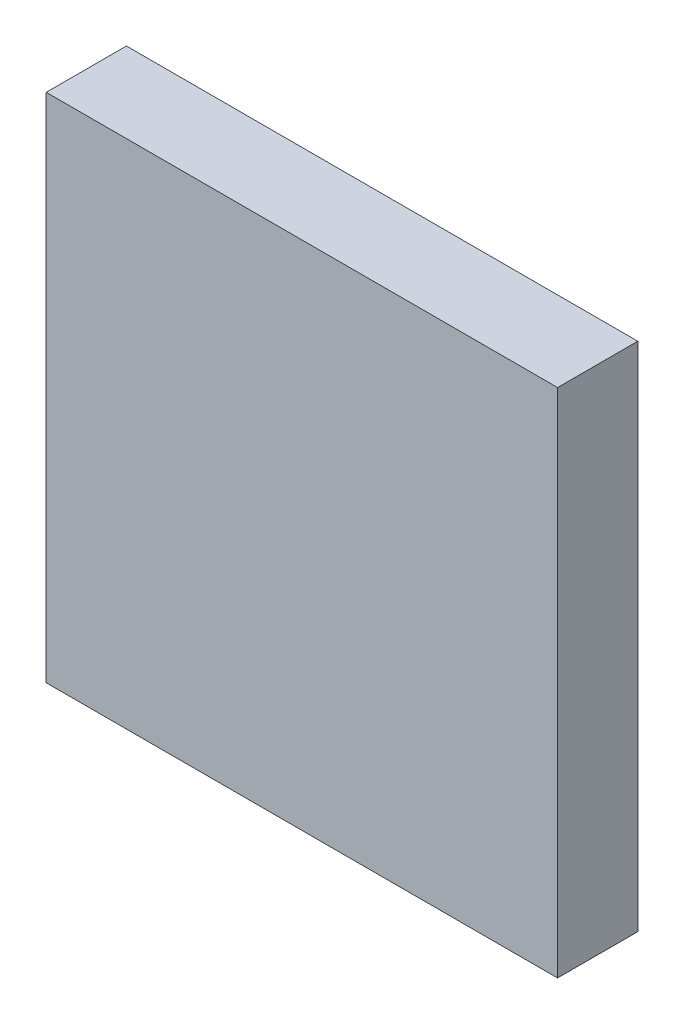
ISO-10303-21;
HEADER;
FILE_DESCRIPTION(('STEP AP214'),'2;1');
FILE_NAME('part.step','',(''),(''),'','','');
FILE_SCHEMA(('AUTOMOTIVE_DESIGN { 1 0 10303 214 1 1 1 1 }'));
ENDSEC;
DATA;
#1=APPLICATION_CONTEXT('core data for automotive mechanical design processes');
#2=APPLICATION_PROTOCOL_DEFINITION('international standard','automotive_design',2000,#1);
#3=PRODUCT_CONTEXT('',#1,'mechanical');
#4=PRODUCT('Part','Part','',(#3));
#5=PRODUCT_RELATED_PRODUCT_CATEGORY('part','',(#4));
#6=PRODUCT_DEFINITION_FORMATION('','',#4);
#7=PRODUCT_DEFINITION_CONTEXT('part definition',#1,'design');
#8=PRODUCT_DEFINITION('design','',#6,#7);
#9=PRODUCT_DEFINITION_SHAPE('','',#8);
#10=(LENGTH_UNIT() NAMED_UNIT(*) SI_UNIT(.MILLI.,.METRE.));
#11=(NAMED_UNIT(*) PLANE_ANGLE_UNIT() SI_UNIT($,.RADIAN.));
#12=(NAMED_UNIT(*) SI_UNIT($,.STERADIAN.) SOLID_ANGLE_UNIT());
#13=UNCERTAINTY_MEASURE_WITH_UNIT(LENGTH_MEASURE(1.E-05),#10,'distance_accuracy_value','');
#14=(GEOMETRIC_REPRESENTATION_CONTEXT(3) GLOBAL_UNCERTAINTY_ASSIGNED_CONTEXT((#13)) GLOBAL_UNIT_ASSIGNED_CONTEXT((#10,
#11,#12)) REPRESENTATION_CONTEXT('',''));
#15=CARTESIAN_POINT('',(0.,0.,0.));
#16=DIRECTION('',(0.,0.,1.));
#17=DIRECTION('',(1.,0.,0.));
#18=AXIS2_PLACEMENT_3D('',#15,#16,#17);
#19=CARTESIAN_POINT('',(-2.54999998,-2.54999998,0.));
#20=DIRECTION('',(-1.,0.,0.));
#21=DIRECTION('',(0.,1.,0.));
#22=AXIS2_PLACEMENT_3D('',#19,#20,#21);
#23=PLANE('',#22);
#24=DIRECTION('',(0.,0.,1.));
#25=VECTOR('',#24,1.);
#26=CARTESIAN_POINT('',(-2.54999998,-2.54999998,0.));
#27=LINE('',#26,#25);
#28=CARTESIAN_POINT('',(-2.54999998,-2.54999998,0.));
#29=VERTEX_POINT('',#28);
#30=CARTESIAN_POINT('',(-2.54999998,-2.54999998,0.80000094));
#31=VERTEX_POINT('',#30);
#32=EDGE_CURVE('E9',#29,#31,#27,.T.);
#33=ORIENTED_EDGE('',*,*,#32,.T.);
#34=DIRECTION('',(0.,1.,0.));
#35=VECTOR('',#34,1.);
#36=CARTESIAN_POINT('',(-2.54999998,-2.54999998,0.80000094));
#37=LINE('',#36,#35);
#38=CARTESIAN_POINT('',(-2.54999998,2.54999998,0.80000094));
#39=VERTEX_POINT('',#38);
#40=EDGE_CURVE('E22',#31,#39,#37,.T.);
#41=ORIENTED_EDGE('',*,*,#40,.T.);
#42=DIRECTION('',(0.,0.,1.));
#43=VECTOR('',#42,1.);
#44=CARTESIAN_POINT('',(-2.54999998,2.54999998,0.));
#45=LINE('',#44,#43);
#46=CARTESIAN_POINT('',(-2.54999998,2.54999998,0.));
#47=VERTEX_POINT('',#46);
#48=EDGE_CURVE('E82',#47,#39,#45,.T.);
#49=ORIENTED_EDGE('',*,*,#48,.F.);
#50=DIRECTION('',(0.,1.,0.));
#51=VECTOR('',#50,1.);
#52=CARTESIAN_POINT('',(-2.54999998,-2.54999998,0.));
#53=LINE('',#52,#51);
#54=EDGE_CURVE('E80',#29,#47,#53,.T.);
#55=ORIENTED_EDGE('',*,*,#54,.F.);
#56=EDGE_LOOP('',(#33,#41,#49,#55));
#57=FACE_BOUND('',#56,.T.);
#58=ADVANCED_FACE('F15',(#57),#23,.T.);
#59=CARTESIAN_POINT('',(-2.54999998,2.54999998,0.));
#60=DIRECTION('',(0.,1.,0.));
#61=DIRECTION('',(1.,0.,0.));
#62=AXIS2_PLACEMENT_3D('',#59,#60,#61);
#63=PLANE('',#62);
#64=ORIENTED_EDGE('',*,*,#48,.T.);
#65=DIRECTION('',(1.,0.,0.));
#66=VECTOR('',#65,1.);
#67=CARTESIAN_POINT('',(-2.54999998,2.54999998,0.80000094));
#68=LINE('',#67,#66);
#69=CARTESIAN_POINT('',(2.54999998,2.54999998,0.80000094));
#70=VERTEX_POINT('',#69);
#71=EDGE_CURVE('E77',#39,#70,#68,.T.);
#72=ORIENTED_EDGE('',*,*,#71,.T.);
#73=DIRECTION('',(0.,0.,1.));
#74=VECTOR('',#73,1.);
#75=CARTESIAN_POINT('',(2.54999998,2.54999998,0.));
#76=LINE('',#75,#74);
#77=CARTESIAN_POINT('',(2.54999998,2.54999998,0.));
#78=VERTEX_POINT('',#77);
#79=EDGE_CURVE('E75',#78,#70,#76,.T.);
#80=ORIENTED_EDGE('',*,*,#79,.F.);
#81=DIRECTION('',(1.,0.,0.));
#82=VECTOR('',#81,1.);
#83=CARTESIAN_POINT('',(-2.54999998,2.54999998,0.));
#84=LINE('',#83,#82);
#85=EDGE_CURVE('E66',#47,#78,#84,.T.);
#86=ORIENTED_EDGE('',*,*,#85,.F.);
#87=EDGE_LOOP('',(#64,#72,#80,#86));
#88=FACE_BOUND('',#87,.T.);
#89=ADVANCED_FACE('F88',(#88),#63,.T.);
#90=CARTESIAN_POINT('',(2.54999998,2.54999998,0.));
#91=DIRECTION('',(1.,0.,0.));
#92=DIRECTION('',(0.,-1.,0.));
#93=AXIS2_PLACEMENT_3D('',#90,#91,#92);
#94=PLANE('',#93);
#95=ORIENTED_EDGE('',*,*,#79,.T.);
#96=DIRECTION('',(0.,-1.,0.));
#97=VECTOR('',#96,1.);
#98=CARTESIAN_POINT('',(2.54999998,2.54999998,0.80000094));
#99=LINE('',#98,#97);
#100=CARTESIAN_POINT('',(2.54999998,-2.54999998,0.80000094));
#101=VERTEX_POINT('',#100);
#102=EDGE_CURVE('E58',#70,#101,#99,.T.);
#103=ORIENTED_EDGE('',*,*,#102,.T.);
#104=DIRECTION('',(0.,0.,1.));
#105=VECTOR('',#104,1.);
#106=CARTESIAN_POINT('',(2.54999998,-2.54999998,0.));
#107=LINE('',#106,#105);
#108=CARTESIAN_POINT('',(2.54999998,-2.54999998,0.));
#109=VERTEX_POINT('',#108);
#110=EDGE_CURVE('E52',#109,#101,#107,.T.);
#111=ORIENTED_EDGE('',*,*,#110,.F.);
#112=DIRECTION('',(0.,-1.,0.));
#113=VECTOR('',#112,1.);
#114=CARTESIAN_POINT('',(2.54999998,2.54999998,0.));
#115=LINE('',#114,#113);
#116=EDGE_CURVE('E56',#78,#109,#115,.T.);
#117=ORIENTED_EDGE('',*,*,#116,.F.);
#118=EDGE_LOOP('',(#95,#103,#111,#117));
#119=FACE_BOUND('',#118,.T.);
#120=ADVANCED_FACE('F55',(#119),#94,.T.);
#121=CARTESIAN_POINT('',(2.54999998,-2.54999998,0.));
#122=DIRECTION('',(0.,-1.,0.));
#123=DIRECTION('',(-1.,0.,0.));
#124=AXIS2_PLACEMENT_3D('',#121,#122,#123);
#125=PLANE('',#124);
#126=ORIENTED_EDGE('',*,*,#110,.T.);
#127=DIRECTION('',(-1.,0.,0.));
#128=VECTOR('',#127,1.);
#129=CARTESIAN_POINT('',(2.54999998,-2.54999998,0.80000094));
#130=LINE('',#129,#128);
#131=EDGE_CURVE('E67',#101,#31,#130,.T.);
#132=ORIENTED_EDGE('',*,*,#131,.T.);
#133=ORIENTED_EDGE('',*,*,#32,.F.);
#134=DIRECTION('',(-1.,0.,0.));
#135=VECTOR('',#134,1.);
#136=CARTESIAN_POINT('',(2.54999998,-2.54999998,0.));
#137=LINE('',#136,#135);
#138=EDGE_CURVE('E65',#109,#29,#137,.T.);
#139=ORIENTED_EDGE('',*,*,#138,.F.);
#140=EDGE_LOOP('',(#126,#132,#133,#139));
#141=FACE_BOUND('',#140,.T.);
#142=ADVANCED_FACE('F69',(#141),#125,.T.);
#143=CARTESIAN_POINT('',(0.,0.,0.));
#144=DIRECTION('',(0.,0.,-1.));
#145=DIRECTION('',(-1.,0.,0.));
#146=AXIS2_PLACEMENT_3D('',#143,#144,#145);
#147=PLANE('',#146);
#148=ORIENTED_EDGE('',*,*,#54,.T.);
#149=ORIENTED_EDGE('',*,*,#85,.T.);
#150=ORIENTED_EDGE('',*,*,#116,.T.);
#151=ORIENTED_EDGE('',*,*,#138,.T.);
#152=EDGE_LOOP('',(#148,#149,#150,#151));
#153=FACE_BOUND('',#152,.T.);
#154=ADVANCED_FACE('F64',(#153),#147,.T.);
#155=CARTESIAN_POINT('',(0.,0.,0.80000094));
#156=DIRECTION('',(0.,0.,-1.));
#157=DIRECTION('',(-1.,0.,0.));
#158=AXIS2_PLACEMENT_3D('',#155,#156,#157);
#159=PLANE('',#158);
#160=ORIENTED_EDGE('',*,*,#131,.F.);
#161=ORIENTED_EDGE('',*,*,#102,.F.);
#162=ORIENTED_EDGE('',*,*,#71,.F.);
#163=ORIENTED_EDGE('',*,*,#40,.F.);
#164=EDGE_LOOP('',(#160,#161,#162,#163));
#165=FACE_BOUND('',#164,.T.);
#166=ADVANCED_FACE('F89',(#165),#159,.F.);
#167=CLOSED_SHELL('',(#58,#89,#120,#142,#154,#166));
#168=MANIFOLD_SOLID_BREP('B1',#167);
#169=ADVANCED_BREP_SHAPE_REPRESENTATION('',(#18,#168),#14);
#170=SHAPE_DEFINITION_REPRESENTATION(#9,#169);
ENDSEC;
END-ISO-10303-21;
